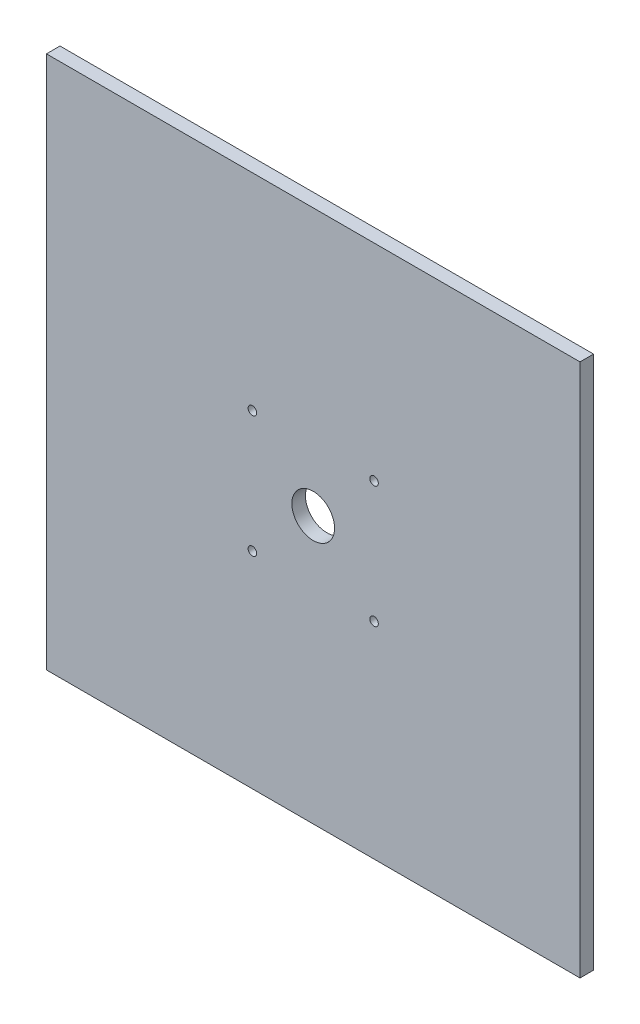
ISO-10303-21;
HEADER;
FILE_DESCRIPTION(('STEP AP214'),'2;1');
FILE_NAME('part.step','',(''),(''),'','','');
FILE_SCHEMA(('AUTOMOTIVE_DESIGN { 1 0 10303 214 1 1 1 1 }'));
ENDSEC;
DATA;
#1=APPLICATION_CONTEXT('core data for automotive mechanical design processes');
#2=APPLICATION_PROTOCOL_DEFINITION('international standard','automotive_design',2000,#1);
#3=PRODUCT_CONTEXT('',#1,'mechanical');
#4=PRODUCT('Part','Part','',(#3));
#5=PRODUCT_RELATED_PRODUCT_CATEGORY('part','',(#4));
#6=PRODUCT_DEFINITION_FORMATION('','',#4);
#7=PRODUCT_DEFINITION_CONTEXT('part definition',#1,'design');
#8=PRODUCT_DEFINITION('design','',#6,#7);
#9=PRODUCT_DEFINITION_SHAPE('','',#8);
#10=(LENGTH_UNIT() NAMED_UNIT(*) SI_UNIT(.MILLI.,.METRE.));
#11=(NAMED_UNIT(*) PLANE_ANGLE_UNIT() SI_UNIT($,.RADIAN.));
#12=(NAMED_UNIT(*) SI_UNIT($,.STERADIAN.) SOLID_ANGLE_UNIT());
#13=UNCERTAINTY_MEASURE_WITH_UNIT(LENGTH_MEASURE(1.E-05),#10,'distance_accuracy_value','');
#14=(GEOMETRIC_REPRESENTATION_CONTEXT(3) GLOBAL_UNCERTAINTY_ASSIGNED_CONTEXT((#13)) GLOBAL_UNIT_ASSIGNED_CONTEXT((#10,
#11,#12)) REPRESENTATION_CONTEXT('',''));
#15=CARTESIAN_POINT('',(0.,0.,0.));
#16=DIRECTION('',(0.,0.,1.));
#17=DIRECTION('',(1.,0.,0.));
#18=AXIS2_PLACEMENT_3D('',#15,#16,#17);
#19=CARTESIAN_POINT('',(-250.,-250.,12.7));
#20=DIRECTION('',(1.,0.,0.));
#21=DIRECTION('',(0.,0.,-1.));
#22=AXIS2_PLACEMENT_3D('',#19,#20,#21);
#23=PLANE('',#22);
#24=DIRECTION('',(0.,-1.,0.));
#25=VECTOR('',#24,1.);
#26=CARTESIAN_POINT('',(-250.,-250.,0.));
#27=LINE('',#26,#25);
#28=CARTESIAN_POINT('',(-250.,250.,0.));
#29=VERTEX_POINT('',#28);
#30=CARTESIAN_POINT('',(-250.,-250.,0.));
#31=VERTEX_POINT('',#30);
#32=EDGE_CURVE('E96',#29,#31,#27,.T.);
#33=ORIENTED_EDGE('',*,*,#32,.T.);
#34=DIRECTION('',(0.,0.,-1.));
#35=VECTOR('',#34,1.);
#36=CARTESIAN_POINT('',(-250.,-250.,12.7));
#37=LINE('',#36,#35);
#38=CARTESIAN_POINT('',(-250.,-250.,12.7));
#39=VERTEX_POINT('',#38);
#40=EDGE_CURVE('E11',#39,#31,#37,.T.);
#41=ORIENTED_EDGE('',*,*,#40,.F.);
#42=DIRECTION('',(0.,-1.,0.));
#43=VECTOR('',#42,1.);
#44=CARTESIAN_POINT('',(-250.,-250.,12.7));
#45=LINE('',#44,#43);
#46=CARTESIAN_POINT('',(-250.,250.,12.7));
#47=VERTEX_POINT('',#46);
#48=EDGE_CURVE('E84',#47,#39,#45,.T.);
#49=ORIENTED_EDGE('',*,*,#48,.F.);
#50=DIRECTION('',(0.,0.,-1.));
#51=VECTOR('',#50,1.);
#52=CARTESIAN_POINT('',(-250.,250.,12.7));
#53=LINE('',#52,#51);
#54=EDGE_CURVE('E92',#47,#29,#53,.T.);
#55=ORIENTED_EDGE('',*,*,#54,.T.);
#56=EDGE_LOOP('',(#33,#41,#49,#55));
#57=FACE_BOUND('',#56,.T.);
#58=ADVANCED_FACE('F33',(#57),#23,.F.);
#59=CARTESIAN_POINT('',(250.,-250.,12.7));
#60=DIRECTION('',(0.,1.,0.));
#61=DIRECTION('',(-1.,0.,0.));
#62=AXIS2_PLACEMENT_3D('',#59,#60,#61);
#63=PLANE('',#62);
#64=DIRECTION('',(1.,0.,0.));
#65=VECTOR('',#64,1.);
#66=CARTESIAN_POINT('',(250.,-250.,0.));
#67=LINE('',#66,#65);
#68=CARTESIAN_POINT('',(250.,-250.,0.));
#69=VERTEX_POINT('',#68);
#70=EDGE_CURVE('E88',#31,#69,#67,.T.);
#71=ORIENTED_EDGE('',*,*,#70,.T.);
#72=DIRECTION('',(0.,0.,-1.));
#73=VECTOR('',#72,1.);
#74=CARTESIAN_POINT('',(250.,-250.,12.7));
#75=LINE('',#74,#73);
#76=CARTESIAN_POINT('',(250.,-250.,12.7));
#77=VERTEX_POINT('',#76);
#78=EDGE_CURVE('E41',#77,#69,#75,.T.);
#79=ORIENTED_EDGE('',*,*,#78,.F.);
#80=DIRECTION('',(1.,0.,0.));
#81=VECTOR('',#80,1.);
#82=CARTESIAN_POINT('',(250.,-250.,12.7));
#83=LINE('',#82,#81);
#84=EDGE_CURVE('E79',#39,#77,#83,.T.);
#85=ORIENTED_EDGE('',*,*,#84,.F.);
#86=ORIENTED_EDGE('',*,*,#40,.T.);
#87=EDGE_LOOP('',(#71,#79,#85,#86));
#88=FACE_BOUND('',#87,.T.);
#89=ADVANCED_FACE('F87',(#88),#63,.F.);
#90=CARTESIAN_POINT('',(250.,-250.,12.7));
#91=DIRECTION('',(-1.,0.,0.));
#92=DIRECTION('',(0.,0.,1.));
#93=AXIS2_PLACEMENT_3D('',#90,#91,#92);
#94=PLANE('',#93);
#95=DIRECTION('',(0.,1.,0.));
#96=VECTOR('',#95,1.);
#97=CARTESIAN_POINT('',(250.,-250.,0.));
#98=LINE('',#97,#96);
#99=CARTESIAN_POINT('',(250.,250.,0.));
#100=VERTEX_POINT('',#99);
#101=EDGE_CURVE('E66',#69,#100,#98,.T.);
#102=ORIENTED_EDGE('',*,*,#101,.T.);
#103=DIRECTION('',(0.,0.,-1.));
#104=VECTOR('',#103,1.);
#105=CARTESIAN_POINT('',(250.,250.,12.7));
#106=LINE('',#105,#104);
#107=CARTESIAN_POINT('',(250.,250.,12.7));
#108=VERTEX_POINT('',#107);
#109=EDGE_CURVE('E89',#108,#100,#106,.T.);
#110=ORIENTED_EDGE('',*,*,#109,.F.);
#111=DIRECTION('',(0.,1.,0.));
#112=VECTOR('',#111,1.);
#113=CARTESIAN_POINT('',(250.,-250.,12.7));
#114=LINE('',#113,#112);
#115=EDGE_CURVE('E82',#77,#108,#114,.T.);
#116=ORIENTED_EDGE('',*,*,#115,.F.);
#117=ORIENTED_EDGE('',*,*,#78,.T.);
#118=EDGE_LOOP('',(#102,#110,#116,#117));
#119=FACE_BOUND('',#118,.T.);
#120=ADVANCED_FACE('F90',(#119),#94,.F.);
#121=CARTESIAN_POINT('',(250.,250.,12.7));
#122=DIRECTION('',(0.,-1.,0.));
#123=DIRECTION('',(1.,0.,0.));
#124=AXIS2_PLACEMENT_3D('',#121,#122,#123);
#125=PLANE('',#124);
#126=DIRECTION('',(-1.,0.,0.));
#127=VECTOR('',#126,1.);
#128=CARTESIAN_POINT('',(250.,250.,0.));
#129=LINE('',#128,#127);
#130=EDGE_CURVE('E72',#100,#29,#129,.T.);
#131=ORIENTED_EDGE('',*,*,#130,.T.);
#132=ORIENTED_EDGE('',*,*,#54,.F.);
#133=DIRECTION('',(-1.,0.,0.));
#134=VECTOR('',#133,1.);
#135=CARTESIAN_POINT('',(250.,250.,12.7));
#136=LINE('',#135,#134);
#137=EDGE_CURVE('E49',#108,#47,#136,.T.);
#138=ORIENTED_EDGE('',*,*,#137,.F.);
#139=ORIENTED_EDGE('',*,*,#109,.T.);
#140=EDGE_LOOP('',(#131,#132,#138,#139));
#141=FACE_BOUND('',#140,.T.);
#142=ADVANCED_FACE('F104',(#141),#125,.F.);
#143=CARTESIAN_POINT('',(0.,0.,12.7));
#144=DIRECTION('',(0.,0.,1.));
#145=DIRECTION('',(1.,0.,0.));
#146=AXIS2_PLACEMENT_3D('',#143,#144,#145);
#147=PLANE('',#146);
#148=CARTESIAN_POINT('',(-57.,57.,12.7));
#149=DIRECTION('',(0.,0.,1.));
#150=DIRECTION('',(1.,0.,0.));
#151=AXIS2_PLACEMENT_3D('',#148,#149,#150);
#152=CIRCLE('',#151,4.);
#153=CARTESIAN_POINT('',(-53.,57.,12.7));
#154=VERTEX_POINT('',#153);
#155=EDGE_CURVE('E133',#154,#154,#152,.T.);
#156=ORIENTED_EDGE('',*,*,#155,.F.);
#157=EDGE_LOOP('',(#156));
#158=FACE_BOUND('',#157,.T.);
#159=CARTESIAN_POINT('',(57.,57.,12.7));
#160=DIRECTION('',(0.,0.,1.));
#161=DIRECTION('',(1.,0.,0.));
#162=AXIS2_PLACEMENT_3D('',#159,#160,#161);
#163=CIRCLE('',#162,4.);
#164=CARTESIAN_POINT('',(61.,57.,12.7));
#165=VERTEX_POINT('',#164);
#166=EDGE_CURVE('E127',#165,#165,#163,.T.);
#167=ORIENTED_EDGE('',*,*,#166,.F.);
#168=EDGE_LOOP('',(#167));
#169=FACE_BOUND('',#168,.T.);
#170=CARTESIAN_POINT('',(57.,-57.,12.7));
#171=DIRECTION('',(0.,0.,1.));
#172=DIRECTION('',(1.,0.,0.));
#173=AXIS2_PLACEMENT_3D('',#170,#171,#172);
#174=CIRCLE('',#173,4.);
#175=CARTESIAN_POINT('',(61.,-57.,12.7));
#176=VERTEX_POINT('',#175);
#177=EDGE_CURVE('E121',#176,#176,#174,.T.);
#178=ORIENTED_EDGE('',*,*,#177,.F.);
#179=EDGE_LOOP('',(#178));
#180=FACE_BOUND('',#179,.T.);
#181=CARTESIAN_POINT('',(-57.,-57.,12.7));
#182=DIRECTION('',(0.,0.,1.));
#183=DIRECTION('',(1.,0.,0.));
#184=AXIS2_PLACEMENT_3D('',#181,#182,#183);
#185=CIRCLE('',#184,4.);
#186=CARTESIAN_POINT('',(-53.,-57.,12.7));
#187=VERTEX_POINT('',#186);
#188=EDGE_CURVE('E115',#187,#187,#185,.T.);
#189=ORIENTED_EDGE('',*,*,#188,.F.);
#190=EDGE_LOOP('',(#189));
#191=FACE_BOUND('',#190,.T.);
#192=CARTESIAN_POINT('',(0.,0.,12.7));
#193=DIRECTION('',(0.,0.,1.));
#194=DIRECTION('',(1.,0.,0.));
#195=AXIS2_PLACEMENT_3D('',#192,#193,#194);
#196=CIRCLE('',#195,20.);
#197=CARTESIAN_POINT('',(20.,0.,12.7));
#198=VERTEX_POINT('',#197);
#199=EDGE_CURVE('E112',#198,#198,#196,.T.);
#200=ORIENTED_EDGE('',*,*,#199,.F.);
#201=EDGE_LOOP('',(#200));
#202=FACE_BOUND('',#201,.T.);
#203=ORIENTED_EDGE('',*,*,#48,.T.);
#204=ORIENTED_EDGE('',*,*,#84,.T.);
#205=ORIENTED_EDGE('',*,*,#115,.T.);
#206=ORIENTED_EDGE('',*,*,#137,.T.);
#207=EDGE_LOOP('',(#203,#204,#205,#206));
#208=FACE_BOUND('',#207,.T.);
#209=ADVANCED_FACE('F80',(#158,#169,#180,#191,#202,#208),#147,.T.);
#210=CARTESIAN_POINT('',(0.,0.,0.));
#211=DIRECTION('',(0.,0.,1.));
#212=DIRECTION('',(1.,0.,0.));
#213=AXIS2_PLACEMENT_3D('',#210,#211,#212);
#214=PLANE('',#213);
#215=CARTESIAN_POINT('',(-57.,57.,0.));
#216=DIRECTION('',(0.,0.,-1.));
#217=DIRECTION('',(-1.,0.,0.));
#218=AXIS2_PLACEMENT_3D('',#215,#216,#217);
#219=CIRCLE('',#218,4.);
#220=CARTESIAN_POINT('',(-61.,57.,0.));
#221=VERTEX_POINT('',#220);
#222=EDGE_CURVE('E136',#221,#221,#219,.T.);
#223=ORIENTED_EDGE('',*,*,#222,.F.);
#224=EDGE_LOOP('',(#223));
#225=FACE_BOUND('',#224,.T.);
#226=CARTESIAN_POINT('',(57.,57.,0.));
#227=DIRECTION('',(0.,0.,-1.));
#228=DIRECTION('',(-1.,0.,0.));
#229=AXIS2_PLACEMENT_3D('',#226,#227,#228);
#230=CIRCLE('',#229,4.);
#231=CARTESIAN_POINT('',(53.,57.,0.));
#232=VERTEX_POINT('',#231);
#233=EDGE_CURVE('E130',#232,#232,#230,.T.);
#234=ORIENTED_EDGE('',*,*,#233,.F.);
#235=EDGE_LOOP('',(#234));
#236=FACE_BOUND('',#235,.T.);
#237=CARTESIAN_POINT('',(57.,-57.,0.));
#238=DIRECTION('',(0.,0.,-1.));
#239=DIRECTION('',(-1.,0.,0.));
#240=AXIS2_PLACEMENT_3D('',#237,#238,#239);
#241=CIRCLE('',#240,4.);
#242=CARTESIAN_POINT('',(53.,-57.,0.));
#243=VERTEX_POINT('',#242);
#244=EDGE_CURVE('E124',#243,#243,#241,.T.);
#245=ORIENTED_EDGE('',*,*,#244,.F.);
#246=EDGE_LOOP('',(#245));
#247=FACE_BOUND('',#246,.T.);
#248=CARTESIAN_POINT('',(-57.,-57.,0.));
#249=DIRECTION('',(0.,0.,-1.));
#250=DIRECTION('',(-1.,0.,0.));
#251=AXIS2_PLACEMENT_3D('',#248,#249,#250);
#252=CIRCLE('',#251,4.);
#253=CARTESIAN_POINT('',(-61.,-57.,0.));
#254=VERTEX_POINT('',#253);
#255=EDGE_CURVE('E118',#254,#254,#252,.T.);
#256=ORIENTED_EDGE('',*,*,#255,.F.);
#257=EDGE_LOOP('',(#256));
#258=FACE_BOUND('',#257,.T.);
#259=CARTESIAN_POINT('',(0.,0.,0.));
#260=DIRECTION('',(0.,0.,1.));
#261=DIRECTION('',(1.,0.,0.));
#262=AXIS2_PLACEMENT_3D('',#259,#260,#261);
#263=CIRCLE('',#262,20.);
#264=CARTESIAN_POINT('',(20.,0.,0.));
#265=VERTEX_POINT('',#264);
#266=EDGE_CURVE('E99',#265,#265,#263,.F.);
#267=ORIENTED_EDGE('',*,*,#266,.F.);
#268=EDGE_LOOP('',(#267));
#269=FACE_BOUND('',#268,.T.);
#270=ORIENTED_EDGE('',*,*,#32,.F.);
#271=ORIENTED_EDGE('',*,*,#130,.F.);
#272=ORIENTED_EDGE('',*,*,#101,.F.);
#273=ORIENTED_EDGE('',*,*,#70,.F.);
#274=EDGE_LOOP('',(#270,#271,#272,#273));
#275=FACE_BOUND('',#274,.T.);
#276=ADVANCED_FACE('F107',(#225,#236,#247,#258,#269,#275),#214,.F.);
#277=CARTESIAN_POINT('',(0.,0.,-56.5685424949238));
#278=DIRECTION('',(0.,0.,1.));
#279=DIRECTION('',(1.,0.,0.));
#280=AXIS2_PLACEMENT_3D('',#277,#278,#279);
#281=CYLINDRICAL_SURFACE('',#280,20.);
#282=CARTESIAN_POINT('',(20.,0.,0.));
#283=CARTESIAN_POINT('',(20.,0.,0.132291666666659));
#284=CARTESIAN_POINT('',(20.,0.,0.264583333333325));
#285=CARTESIAN_POINT('',(20.,0.,0.529166666666659));
#286=CARTESIAN_POINT('',(20.,0.,0.661458333333328));
#287=CARTESIAN_POINT('',(20.,0.,0.926041666666662));
#288=CARTESIAN_POINT('',(20.,0.,1.05833333333333));
#289=CARTESIAN_POINT('',(20.,0.,1.32291666666666));
#290=CARTESIAN_POINT('',(20.,0.,1.45520833333333));
#291=CARTESIAN_POINT('',(20.,0.,1.71979166666666));
#292=CARTESIAN_POINT('',(20.,0.,1.85208333333333));
#293=CARTESIAN_POINT('',(20.,0.,2.11666666666666));
#294=CARTESIAN_POINT('',(20.,0.,2.24895833333333));
#295=CARTESIAN_POINT('',(20.,0.,2.51354166666666));
#296=CARTESIAN_POINT('',(20.,0.,2.64583333333333));
#297=CARTESIAN_POINT('',(20.,0.,2.91041666666667));
#298=CARTESIAN_POINT('',(20.,0.,3.04270833333333));
#299=CARTESIAN_POINT('',(20.,0.,3.30729166666666));
#300=CARTESIAN_POINT('',(20.,0.,3.43958333333333));
#301=CARTESIAN_POINT('',(20.,0.,3.70416666666666));
#302=CARTESIAN_POINT('',(20.,0.,3.83645833333333));
#303=CARTESIAN_POINT('',(20.,0.,4.10104166666667));
#304=CARTESIAN_POINT('',(20.,0.,4.23333333333333));
#305=CARTESIAN_POINT('',(20.,0.,4.49791666666666));
#306=CARTESIAN_POINT('',(20.,0.,4.63020833333333));
#307=CARTESIAN_POINT('',(20.,0.,4.89479166666666));
#308=CARTESIAN_POINT('',(20.,0.,5.02708333333333));
#309=CARTESIAN_POINT('',(20.,0.,5.29166666666667));
#310=CARTESIAN_POINT('',(20.,0.,5.42395833333333));
#311=CARTESIAN_POINT('',(20.,0.,5.68854166666666));
#312=CARTESIAN_POINT('',(20.,0.,5.82083333333333));
#313=CARTESIAN_POINT('',(20.,0.,6.08541666666666));
#314=CARTESIAN_POINT('',(20.,0.,6.21770833333333));
#315=CARTESIAN_POINT('',(20.,0.,6.48229166666666));
#316=CARTESIAN_POINT('',(20.,0.,6.61458333333333));
#317=CARTESIAN_POINT('',(20.,0.,6.87916666666666));
#318=CARTESIAN_POINT('',(20.,0.,7.01145833333333));
#319=CARTESIAN_POINT('',(20.,0.,7.27604166666666));
#320=CARTESIAN_POINT('',(20.,0.,7.40833333333333));
#321=CARTESIAN_POINT('',(20.,0.,7.67291666666666));
#322=CARTESIAN_POINT('',(20.,0.,7.80520833333333));
#323=CARTESIAN_POINT('',(20.,0.,8.06979166666666));
#324=CARTESIAN_POINT('',(20.,0.,8.20208333333333));
#325=CARTESIAN_POINT('',(20.,0.,8.46666666666666));
#326=CARTESIAN_POINT('',(20.,0.,8.59895833333333));
#327=CARTESIAN_POINT('',(20.,0.,8.86354166666666));
#328=CARTESIAN_POINT('',(20.,0.,8.99583333333333));
#329=CARTESIAN_POINT('',(20.,0.,9.26041666666666));
#330=CARTESIAN_POINT('',(20.,0.,9.39270833333333));
#331=CARTESIAN_POINT('',(20.,0.,9.65729166666666));
#332=CARTESIAN_POINT('',(20.,0.,9.78958333333333));
#333=CARTESIAN_POINT('',(20.,0.,10.0541666666667));
#334=CARTESIAN_POINT('',(20.,0.,10.1864583333333));
#335=CARTESIAN_POINT('',(20.,0.,10.4510416666667));
#336=CARTESIAN_POINT('',(20.,0.,10.5833333333333));
#337=CARTESIAN_POINT('',(20.,0.,10.8479166666667));
#338=CARTESIAN_POINT('',(20.,0.,10.9802083333333));
#339=CARTESIAN_POINT('',(20.,0.,11.2447916666667));
#340=CARTESIAN_POINT('',(20.,0.,11.3770833333333));
#341=CARTESIAN_POINT('',(20.,0.,11.6416666666667));
#342=CARTESIAN_POINT('',(20.,0.,11.7739583333333));
#343=CARTESIAN_POINT('',(20.,0.,12.0385416666667));
#344=CARTESIAN_POINT('',(20.,0.,12.1708333333333));
#345=CARTESIAN_POINT('',(20.,0.,12.4354166666667));
#346=CARTESIAN_POINT('',(20.,0.,12.5677083333333));
#347=CARTESIAN_POINT('',(20.,0.,12.7));
#348=B_SPLINE_CURVE_WITH_KNOTS('',3,(#282,#283,#284,#285,#286,#287,#288,#289,#290,#291,#292,
#293,#294,#295,#296,#297,#298,#299,#300,#301,#302,#303,#304,#305,#306,#307,#308,#309,#310,#311,
#312,#313,#314,#315,#316,#317,#318,#319,#320,#321,#322,#323,#324,#325,#326,#327,#328,#329,#330,
#331,#332,#333,#334,#335,#336,#337,#338,#339,#340,#341,#342,#343,#344,#345,#346,#347),
.UNSPECIFIED.,.F.,.F.,(4,2,2,2,2,2,2,2,2,2,2,2,2,2,2,2,2,2,2,2,2,2,2,2,2,2,2,2,2,2,2,2,4),(0.,
0.396874999999998,0.793750000000003,1.190625,1.58750000000001,1.984375,2.38125,2.77812500000001,
3.175,3.571875,3.96875000000001,4.365625,4.7625,5.15937500000001,5.55625000000001,5.953125,6.35,
6.74687500000001,7.14375,7.540625,7.93750000000001,8.334375,8.73125,9.12812500000001,9.525,
9.921875,10.31875,10.715625,11.1125,11.509375,11.90625,12.303125,12.7),.UNSPECIFIED.);
#349=EDGE_CURVE('BSEAM144',#265,#198,#348,.T.);
#350=ORIENTED_EDGE('',*,*,#266,.T.);
#351=ORIENTED_EDGE('',*,*,#199,.T.);
#352=ORIENTED_EDGE('',*,*,#349,.T.);
#353=ORIENTED_EDGE('',*,*,#349,.F.);
#354=EDGE_LOOP('',(#350,#352,#351,#353));
#355=FACE_BOUND('',#354,.T.);
#356=ADVANCED_FACE('F144',(#355),#281,.F.);
#357=CARTESIAN_POINT('',(-57.,-57.,0.));
#358=DIRECTION('',(0.,0.,-1.));
#359=DIRECTION('',(-1.,0.,0.));
#360=AXIS2_PLACEMENT_3D('',#357,#358,#359);
#361=CYLINDRICAL_SURFACE('',#360,4.);
#362=ORIENTED_EDGE('',*,*,#188,.T.);
#363=EDGE_LOOP('',(#362));
#364=FACE_BOUND('',#363,.T.);
#365=ORIENTED_EDGE('',*,*,#255,.T.);
#366=EDGE_LOOP('',(#365));
#367=FACE_BOUND('',#366,.T.);
#368=ADVANCED_FACE('F156',(#364,#367),#361,.F.);
#369=CARTESIAN_POINT('',(57.,-57.,0.));
#370=DIRECTION('',(0.,0.,-1.));
#371=DIRECTION('',(-1.,0.,0.));
#372=AXIS2_PLACEMENT_3D('',#369,#370,#371);
#373=CYLINDRICAL_SURFACE('',#372,4.);
#374=ORIENTED_EDGE('',*,*,#177,.T.);
#375=EDGE_LOOP('',(#374));
#376=FACE_BOUND('',#375,.T.);
#377=ORIENTED_EDGE('',*,*,#244,.T.);
#378=EDGE_LOOP('',(#377));
#379=FACE_BOUND('',#378,.T.);
#380=ADVANCED_FACE('F208',(#376,#379),#373,.F.);
#381=CARTESIAN_POINT('',(57.,57.,0.));
#382=DIRECTION('',(0.,0.,-1.));
#383=DIRECTION('',(-1.,0.,0.));
#384=AXIS2_PLACEMENT_3D('',#381,#382,#383);
#385=CYLINDRICAL_SURFACE('',#384,4.);
#386=ORIENTED_EDGE('',*,*,#166,.T.);
#387=EDGE_LOOP('',(#386));
#388=FACE_BOUND('',#387,.T.);
#389=ORIENTED_EDGE('',*,*,#233,.T.);
#390=EDGE_LOOP('',(#389));
#391=FACE_BOUND('',#390,.T.);
#392=ADVANCED_FACE('F218',(#388,#391),#385,.F.);
#393=CARTESIAN_POINT('',(-57.,57.,0.));
#394=DIRECTION('',(0.,0.,-1.));
#395=DIRECTION('',(-1.,0.,0.));
#396=AXIS2_PLACEMENT_3D('',#393,#394,#395);
#397=CYLINDRICAL_SURFACE('',#396,4.);
#398=ORIENTED_EDGE('',*,*,#155,.T.);
#399=EDGE_LOOP('',(#398));
#400=FACE_BOUND('',#399,.T.);
#401=ORIENTED_EDGE('',*,*,#222,.T.);
#402=EDGE_LOOP('',(#401));
#403=FACE_BOUND('',#402,.T.);
#404=ADVANCED_FACE('F140',(#400,#403),#397,.F.);
#405=CLOSED_SHELL('',(#58,#89,#120,#142,#209,#276,#356,#368,#380,#392,#404));
#406=MANIFOLD_SOLID_BREP('B2',#405);
#407=ADVANCED_BREP_SHAPE_REPRESENTATION('',(#18,#406),#14);
#408=SHAPE_DEFINITION_REPRESENTATION(#9,#407);
ENDSEC;
END-ISO-10303-21;
